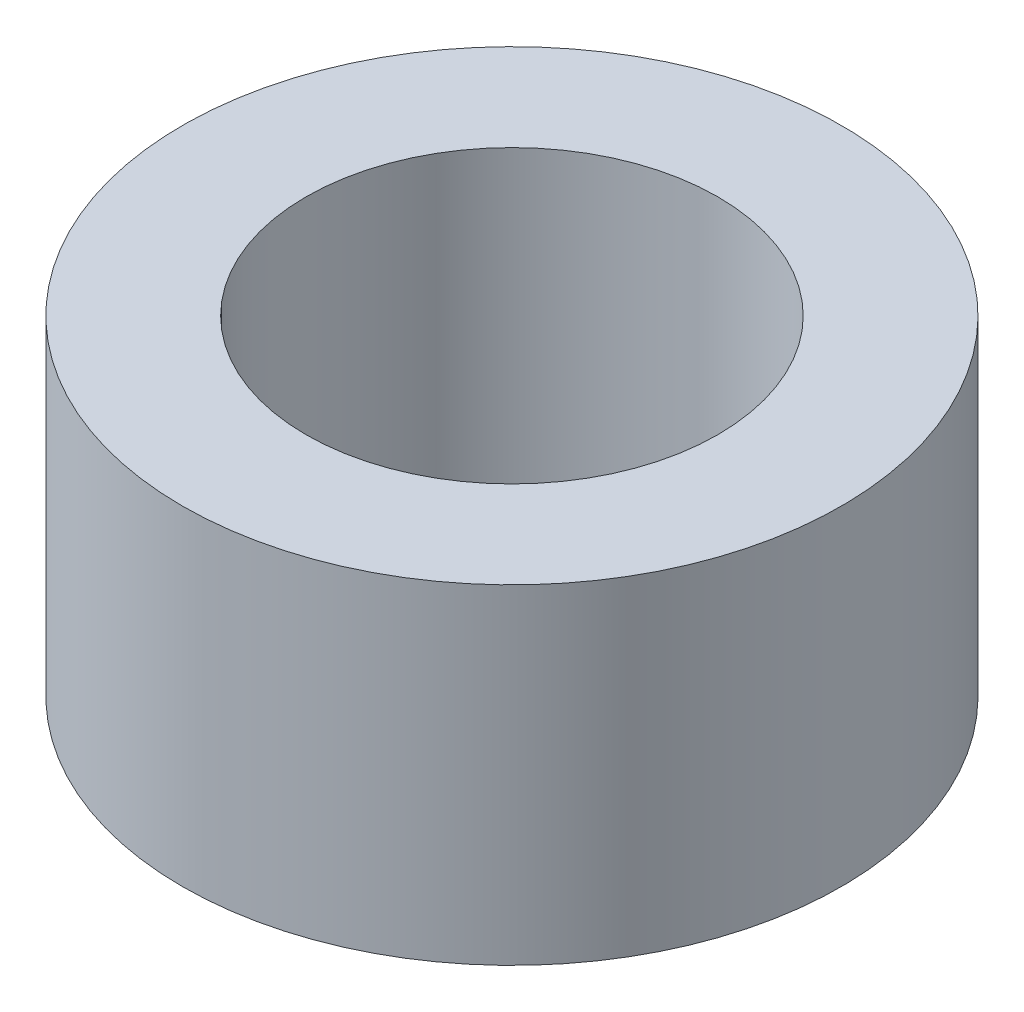
ISO-10303-21;
HEADER;
FILE_DESCRIPTION(('STEP AP214'),'2;1');
FILE_NAME('part.step','',(''),(''),'','','');
FILE_SCHEMA(('AUTOMOTIVE_DESIGN { 1 0 10303 214 1 1 1 1 }'));
ENDSEC;
DATA;
#1=APPLICATION_CONTEXT('core data for automotive mechanical design processes');
#2=APPLICATION_PROTOCOL_DEFINITION('international standard','automotive_design',2000,#1);
#3=PRODUCT_CONTEXT('',#1,'mechanical');
#4=PRODUCT('Part','Part','',(#3));
#5=PRODUCT_RELATED_PRODUCT_CATEGORY('part','',(#4));
#6=PRODUCT_DEFINITION_FORMATION('','',#4);
#7=PRODUCT_DEFINITION_CONTEXT('part definition',#1,'design');
#8=PRODUCT_DEFINITION('design','',#6,#7);
#9=PRODUCT_DEFINITION_SHAPE('','',#8);
#10=(LENGTH_UNIT() NAMED_UNIT(*) SI_UNIT(.MILLI.,.METRE.));
#11=(NAMED_UNIT(*) PLANE_ANGLE_UNIT() SI_UNIT($,.RADIAN.));
#12=(NAMED_UNIT(*) SI_UNIT($,.STERADIAN.) SOLID_ANGLE_UNIT());
#13=UNCERTAINTY_MEASURE_WITH_UNIT(LENGTH_MEASURE(1.E-05),#10,'distance_accuracy_value','');
#14=(GEOMETRIC_REPRESENTATION_CONTEXT(3) GLOBAL_UNCERTAINTY_ASSIGNED_CONTEXT((#13)) GLOBAL_UNIT_ASSIGNED_CONTEXT((#10,
#11,#12)) REPRESENTATION_CONTEXT('',''));
#15=CARTESIAN_POINT('',(0.,0.,0.));
#16=DIRECTION('',(0.,0.,1.));
#17=DIRECTION('',(1.,0.,0.));
#18=AXIS2_PLACEMENT_3D('',#15,#16,#17);
#19=CARTESIAN_POINT('',(0.,10.,0.));
#20=DIRECTION('',(0.,1.,0.));
#21=DIRECTION('',(0.,0.,1.));
#22=AXIS2_PLACEMENT_3D('',#19,#20,#21);
#23=PLANE('',#22);
#24=CARTESIAN_POINT('',(0.,10.,0.));
#25=DIRECTION('',(0.,1.,0.));
#26=DIRECTION('',(0.,0.,1.));
#27=AXIS2_PLACEMENT_3D('',#24,#25,#26);
#28=CIRCLE('',#27,20.);
#29=CARTESIAN_POINT('',(0.,10.,20.));
#30=VERTEX_POINT('',#29);
#31=EDGE_CURVE('E10',#30,#30,#28,.T.);
#32=ORIENTED_EDGE('',*,*,#31,.T.);
#33=EDGE_LOOP('',(#32));
#34=FACE_BOUND('',#33,.T.);
#35=CARTESIAN_POINT('',(0.,10.,0.));
#36=DIRECTION('',(0.,1.,0.));
#37=DIRECTION('',(0.,0.,1.));
#38=AXIS2_PLACEMENT_3D('',#35,#36,#37);
#39=CIRCLE('',#38,12.5);
#40=CARTESIAN_POINT('',(0.,10.,12.5));
#41=VERTEX_POINT('',#40);
#42=EDGE_CURVE('E42',#41,#41,#39,.T.);
#43=ORIENTED_EDGE('',*,*,#42,.F.);
#44=EDGE_LOOP('',(#43));
#45=FACE_BOUND('',#44,.T.);
#46=ADVANCED_FACE('F31',(#34,#45),#23,.T.);
#47=CARTESIAN_POINT('',(0.,-10.,0.));
#48=DIRECTION('',(0.,1.,0.));
#49=DIRECTION('',(0.,0.,1.));
#50=AXIS2_PLACEMENT_3D('',#47,#48,#49);
#51=PLANE('',#50);
#52=CARTESIAN_POINT('',(0.,-10.,0.));
#53=DIRECTION('',(0.,1.,0.));
#54=DIRECTION('',(0.,0.,1.));
#55=AXIS2_PLACEMENT_3D('',#52,#53,#54);
#56=CIRCLE('',#55,20.);
#57=CARTESIAN_POINT('',(0.,-10.,20.));
#58=VERTEX_POINT('',#57);
#59=EDGE_CURVE('E35',#58,#58,#56,.T.);
#60=ORIENTED_EDGE('',*,*,#59,.F.);
#61=EDGE_LOOP('',(#60));
#62=FACE_BOUND('',#61,.T.);
#63=CARTESIAN_POINT('',(0.,-10.,0.));
#64=DIRECTION('',(0.,1.,0.));
#65=DIRECTION('',(0.,0.,1.));
#66=AXIS2_PLACEMENT_3D('',#63,#64,#65);
#67=CIRCLE('',#66,12.5);
#68=CARTESIAN_POINT('',(0.,-10.,12.5));
#69=VERTEX_POINT('',#68);
#70=EDGE_CURVE('E44',#69,#69,#67,.T.);
#71=ORIENTED_EDGE('',*,*,#70,.T.);
#72=EDGE_LOOP('',(#71));
#73=FACE_BOUND('',#72,.T.);
#74=ADVANCED_FACE('F54',(#62,#73),#51,.F.);
#75=CARTESIAN_POINT('',(0.,10.,0.));
#76=DIRECTION('',(0.,-1.,0.));
#77=DIRECTION('',(0.,0.,-1.));
#78=AXIS2_PLACEMENT_3D('',#75,#76,#77);
#79=CYLINDRICAL_SURFACE('',#78,20.);
#80=ORIENTED_EDGE('',*,*,#31,.F.);
#81=EDGE_LOOP('',(#80));
#82=FACE_BOUND('',#81,.T.);
#83=ORIENTED_EDGE('',*,*,#59,.T.);
#84=EDGE_LOOP('',(#83));
#85=FACE_BOUND('',#84,.T.);
#86=ADVANCED_FACE('F33',(#82,#85),#79,.T.);
#87=CARTESIAN_POINT('',(0.,10.,0.));
#88=DIRECTION('',(0.,-1.,0.));
#89=DIRECTION('',(0.,0.,-1.));
#90=AXIS2_PLACEMENT_3D('',#87,#88,#89);
#91=CYLINDRICAL_SURFACE('',#90,12.5);
#92=ORIENTED_EDGE('',*,*,#42,.T.);
#93=EDGE_LOOP('',(#92));
#94=FACE_BOUND('',#93,.T.);
#95=ORIENTED_EDGE('',*,*,#70,.F.);
#96=EDGE_LOOP('',(#95));
#97=FACE_BOUND('',#96,.T.);
#98=ADVANCED_FACE('F50',(#94,#97),#91,.F.);
#99=CLOSED_SHELL('',(#46,#74,#86,#98));
#100=MANIFOLD_SOLID_BREP('B2',#99);
#101=ADVANCED_BREP_SHAPE_REPRESENTATION('',(#18,#100),#14);
#102=SHAPE_DEFINITION_REPRESENTATION(#9,#101);
ENDSEC;
END-ISO-10303-21;
